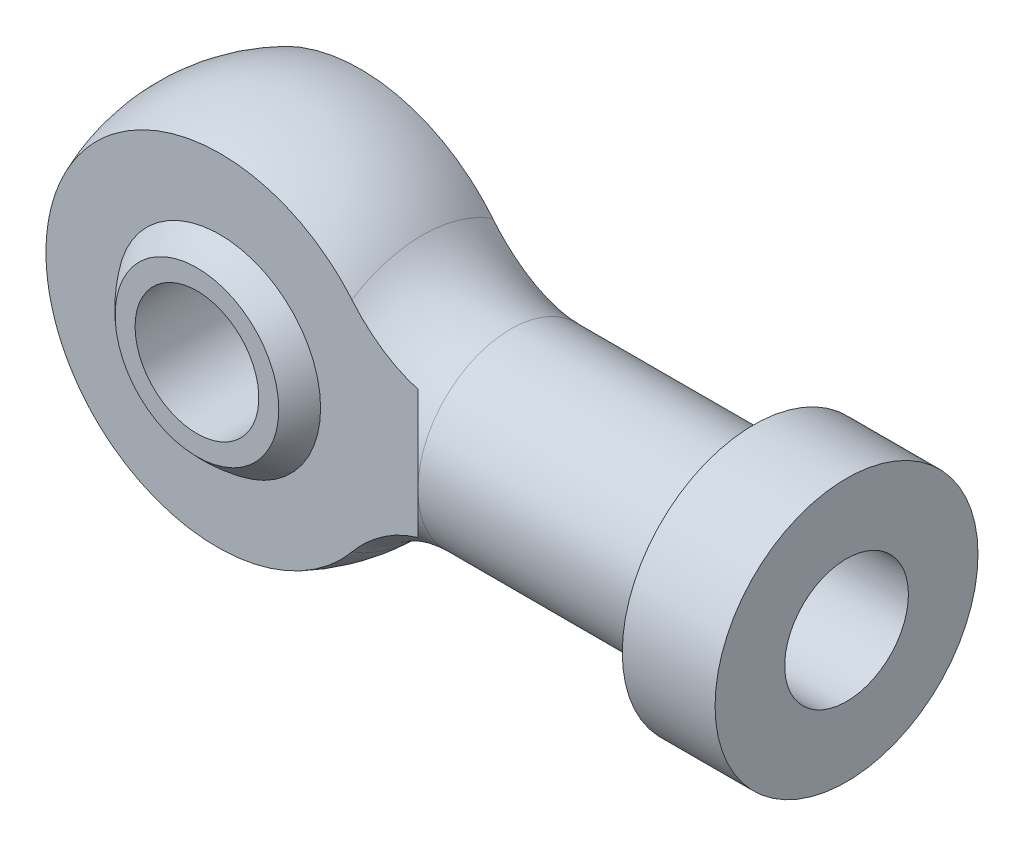
ISO-10303-21;
HEADER;
FILE_DESCRIPTION(('STEP AP214'),'2;1');
FILE_NAME('part.step','',(''),(''),'','','');
FILE_SCHEMA(('AUTOMOTIVE_DESIGN { 1 0 10303 214 1 1 1 1 }'));
ENDSEC;
DATA;
#1=APPLICATION_CONTEXT('core data for automotive mechanical design processes');
#2=APPLICATION_PROTOCOL_DEFINITION('international standard','automotive_design',2000,#1);
#3=PRODUCT_CONTEXT('',#1,'mechanical');
#4=PRODUCT('Part','Part','',(#3));
#5=PRODUCT_RELATED_PRODUCT_CATEGORY('part','',(#4));
#6=PRODUCT_DEFINITION_FORMATION('','',#4);
#7=PRODUCT_DEFINITION_CONTEXT('part definition',#1,'design');
#8=PRODUCT_DEFINITION('design','',#6,#7);
#9=PRODUCT_DEFINITION_SHAPE('','',#8);
#10=(LENGTH_UNIT() NAMED_UNIT(*) SI_UNIT(.MILLI.,.METRE.));
#11=(NAMED_UNIT(*) PLANE_ANGLE_UNIT() SI_UNIT($,.RADIAN.));
#12=(NAMED_UNIT(*) SI_UNIT($,.STERADIAN.) SOLID_ANGLE_UNIT());
#13=UNCERTAINTY_MEASURE_WITH_UNIT(LENGTH_MEASURE(1.E-05),#10,'distance_accuracy_value','');
#14=(GEOMETRIC_REPRESENTATION_CONTEXT(3) GLOBAL_UNCERTAINTY_ASSIGNED_CONTEXT((#13)) GLOBAL_UNIT_ASSIGNED_CONTEXT((#10,
#11,#12)) REPRESENTATION_CONTEXT('',''));
#15=CARTESIAN_POINT('',(0.,0.,0.));
#16=DIRECTION('',(0.,0.,1.));
#17=DIRECTION('',(1.,0.,0.));
#18=AXIS2_PLACEMENT_3D('',#15,#16,#17);
#19=CARTESIAN_POINT('',(0.0422581542258365,-12.5,-4.6299750898934));
#20=DIRECTION('',(-0.00912670011982922,0.,0.999958350805134));
#21=DIRECTION('',(0.999958350805134,0.,0.00912670011982922));
#22=AXIS2_PLACEMENT_3D('',#19,#20,#21);
#23=PLANE('',#22);
#24=DIRECTION('',(0.,1.,0.));
#25=VECTOR('',#24,1.);
#26=CARTESIAN_POINT('',(12.7964236498752,-12.5,-4.5135667978243));
#27=LINE('',#26,#25);
#28=CARTESIAN_POINT('',(12.7964236498752,-4.16158480786618,-4.5135667978243));
#29=VERTEX_POINT('',#28);
#30=CARTESIAN_POINT('',(12.7964236498752,4.16158480786618,-4.5135667978243));
#31=VERTEX_POINT('',#30);
#32=EDGE_CURVE('E88',#29,#31,#27,.T.);
#33=ORIENTED_EDGE('',*,*,#32,.F.);
#34=CARTESIAN_POINT('',(8.35817863747099,-7.32385766302893,-4.55407501624552));
#35=CARTESIAN_POINT('',(8.4458998709203,-7.21051474528737,-4.55327437750773));
#36=CARTESIAN_POINT('',(8.53596775633073,-7.09901109940731,-4.55245232068916));
#37=CARTESIAN_POINT('',(8.72068329239499,-6.87985776005783,-4.55076640716708));
#38=CARTESIAN_POINT('',(8.81533110683538,-6.77220820465756,-4.54990254896869));
#39=CARTESIAN_POINT('',(9.10616690602969,-6.45509503593651,-4.54724806728831));
#40=CARTESIAN_POINT('',(9.3090634382171,-6.25170455611451,-4.5453962143555));
#41=CARTESIAN_POINT('',(9.72473971556463,-5.86956169864926,-4.54160230361189));
#42=CARTESIAN_POINT('',(9.93698062751675,-5.69022177746997,-4.53966516377503));
#43=CARTESIAN_POINT('',(10.3764742452845,-5.35103149247474,-4.53565387025394));
#44=CARTESIAN_POINT('',(10.6037201862185,-5.19117243714522,-4.53357977831333));
#45=CARTESIAN_POINT('',(11.0033211880932,-4.93815458958444,-4.52993258789909));
#46=CARTESIAN_POINT('',(11.1720482919383,-4.83924656540789,-4.52839260208104));
#47=CARTESIAN_POINT('',(11.5164026530707,-4.65431519181695,-4.5252496521907));
#48=CARTESIAN_POINT('',(11.6920279255465,-4.56828816993772,-4.52364670623394));
#49=CARTESIAN_POINT('',(12.0539571867923,-4.40919212186401,-4.52034334881978));
#50=CARTESIAN_POINT('',(12.2404138120469,-4.33646619486379,-4.51864154423693));
#51=CARTESIAN_POINT('',(12.619710154475,-4.20869585511339,-4.51517967607902));
#52=CARTESIAN_POINT('',(12.8125628948826,-4.15369031497932,-4.51341949363985));
#53=CARTESIAN_POINT('',(13.0079591266563,-4.10882649485166,-4.51163609655086));
#54=B_SPLINE_CURVE_WITH_KNOTS('',3,(#34,#35,#36,#37,#38,#39,#40,#41,#42,#43,#44,#45,#46,#47,#48,
#49,#50,#51,#52,#53),.UNSPECIFIED.,.F.,.F.,(4,2,2,2,2,2,2,2,2,4),(0.,0.429909425919432,
0.859834237557637,1.72058233589881,2.55323244040861,3.38550968196544,3.97179618868992,
4.55791522139451,5.15749963966172,5.75839052875296),.UNSPECIFIED.);
#55=CARTESIAN_POINT('',(8.56971411425212,-7.05960212304251,-4.55214431497208));
#56=VERTEX_POINT('',#55);
#57=EDGE_CURVE('E157',#56,#29,#54,.T.);
#58=ORIENTED_EDGE('',*,*,#57,.F.);
#59=CARTESIAN_POINT('',(0.0422581542258365,0.,-4.6299750898934));
#60=DIRECTION('',(-0.00912670011982922,0.,0.999958350805134));
#61=DIRECTION('',(0.999958350805134,0.,0.00912670011982922));
#62=AXIS2_PLACEMENT_3D('',#59,#60,#61);
#63=CIRCLE('',#62,11.0707517773356);
#64=CARTESIAN_POINT('',(8.56971411425212,7.05960212304251,-4.55214431497208));
#65=VERTEX_POINT('',#64);
#66=EDGE_CURVE('E135',#56,#65,#63,.F.);
#67=ORIENTED_EDGE('',*,*,#66,.T.);
#68=CARTESIAN_POINT('',(13.0079591266563,4.10882649485165,-4.51163609655086));
#69=CARTESIAN_POINT('',(12.7850899546431,4.16000422166721,-4.51367024137027));
#70=CARTESIAN_POINT('',(12.5655970674054,4.22434465888993,-4.51567357056757));
#71=CARTESIAN_POINT('',(12.1351753667175,4.37565583382234,-4.51960206397341));
#72=CARTESIAN_POINT('',(11.9242247556973,4.46256414430115,-4.52152742713011));
#73=CARTESIAN_POINT('',(11.5166338372794,4.65321698479729,-4.52524754215387));
#74=CARTESIAN_POINT('',(11.3197674594411,4.7564854057114,-4.52704435738398));
#75=CARTESIAN_POINT('',(10.9349946712431,4.97880070783884,-4.53055620950195));
#76=CARTESIAN_POINT('',(10.7470955352246,5.09786011268654,-4.53227117999631));
#77=CARTESIAN_POINT('',(10.3569521299462,5.36600787309648,-4.53583205016739));
#78=CARTESIAN_POINT('',(10.156010615362,5.51698809374636,-4.53766605949763));
#79=CARTESIAN_POINT('',(9.76662628099556,5.8342131802327,-4.54122000156758));
#80=CARTESIAN_POINT('',(9.57818296637791,6.00045744110487,-4.54293993882369));
#81=CARTESIAN_POINT('',(9.2089075424023,6.35172452367933,-4.54631034525465));
#82=CARTESIAN_POINT('',(9.02846613343789,6.53715767806347,-4.54795724847566));
#83=CARTESIAN_POINT('',(8.68220007105295,6.92105757019634,-4.55111764661676));
#84=CARTESIAN_POINT('',(8.51636885741589,7.11951838773272,-4.55263120141247));
#85=CARTESIAN_POINT('',(8.35817863747099,7.32385766302893,-4.55407501624552));
#86=B_SPLINE_CURVE_WITH_KNOTS('',3,(#68,#69,#70,#71,#72,#73,#74,#75,#76,#77,#78,#79,#80,#81,#82,
#83,#84,#85),.UNSPECIFIED.,.F.,.F.,(4,2,2,2,2,2,2,2,4),(0.,0.685137380260775,1.36839935726479,
2.03455121235177,2.70123457917343,3.45443448550478,4.20760455291298,4.98308058135684,
5.75820661463659),.UNSPECIFIED.);
#87=EDGE_CURVE('E151',#31,#65,#86,.T.);
#88=ORIENTED_EDGE('',*,*,#87,.F.);
#89=EDGE_LOOP('',(#33,#58,#67,#88));
#90=FACE_BOUND('',#89,.T.);
#91=CARTESIAN_POINT('',(0.0422581542258365,0.,-4.6299750898934));
#92=DIRECTION('',(-0.00912670011982922,0.,0.999958350805134));
#93=DIRECTION('',(0.999958350805134,0.,0.00912670011982922));
#94=AXIS2_PLACEMENT_3D('',#91,#92,#93);
#95=CIRCLE('',#94,6.52392097709419);
#96=CARTESIAN_POINT('',(6.56590741526396,0.,-4.57043321953));
#97=VERTEX_POINT('',#96);
#98=EDGE_CURVE('E11',#97,#97,#95,.F.);
#99=ORIENTED_EDGE('',*,*,#98,.F.);
#100=EDGE_LOOP('',(#99));
#101=FACE_BOUND('',#100,.T.);
#102=ADVANCED_FACE('F34',(#90,#101),#23,.F.);
#103=CARTESIAN_POINT('',(0.0422581542167409,-12.5,4.62997508728362));
#104=DIRECTION('',(-0.00912670012300901,0.,-0.999958350805105));
#105=DIRECTION('',(-0.999958350805105,0.,0.00912670012300901));
#106=AXIS2_PLACEMENT_3D('',#103,#104,#105);
#107=PLANE('',#106);
#108=DIRECTION('',(0.,1.,0.));
#109=VECTOR('',#108,1.);
#110=CARTESIAN_POINT('',(12.7964236522398,-12.5,4.51356679515228));
#111=LINE('',#110,#109);
#112=CARTESIAN_POINT('',(12.7964236522398,-4.16158481010453,4.51356679515228));
#113=VERTEX_POINT('',#112);
#114=CARTESIAN_POINT('',(12.7964236522398,4.16158481010453,4.51356679515228));
#115=VERTEX_POINT('',#114);
#116=EDGE_CURVE('E85',#113,#115,#111,.T.);
#117=ORIENTED_EDGE('',*,*,#116,.T.);
#118=CARTESIAN_POINT('',(8.35817863735276,7.323857664821,4.55407501361028));
#119=CARTESIAN_POINT('',(8.44589987077188,7.2105147471393,4.55327437487249));
#120=CARTESIAN_POINT('',(8.53596775615084,7.09901110131843,4.55245231805392));
#121=CARTESIAN_POINT('',(8.72068329214966,6.87985776208594,4.55076640453185));
#122=CARTESIAN_POINT('',(8.81533110655608,6.77220820674347,4.54990254633347));
#123=CARTESIAN_POINT('',(9.10616690564388,6.45509503819483,4.54724806465314));
#124=CARTESIAN_POINT('',(9.30906343775508,6.25170455848521,4.54539621172037));
#125=CARTESIAN_POINT('',(9.72473971493965,5.86956170123708,4.54160230097693));
#126=CARTESIAN_POINT('',(9.93698062680507,5.69022178016248,4.53966516114019));
#127=CARTESIAN_POINT('',(10.3764742443892,5.3510314953657,4.53565386761938));
#128=CARTESIAN_POINT('',(10.6037201852262,5.19117244012999,4.53357977567893));
#129=CARTESIAN_POINT('',(11.0033211872515,4.93815459250735,4.52993258526204));
#130=CARTESIAN_POINT('',(11.1720482913612,4.83924656820198,4.52839259944104));
#131=CARTESIAN_POINT('',(11.516402653042,4.6543151943946,4.5252496495446));
#132=CARTESIAN_POINT('',(11.6920279258017,4.56828817242774,4.52364670358469));
#133=CARTESIAN_POINT('',(12.0539571876481,4.40919212422018,4.5203433461639));
#134=CARTESIAN_POINT('',(12.2404138132204,4.33646619717573,4.51864154157756));
#135=CARTESIAN_POINT('',(12.619710156296,4.20869585739443,4.51517967341253));
#136=CARTESIAN_POINT('',(12.8125628970336,4.15369031727391,4.51341949096974));
#137=CARTESIAN_POINT('',(13.0079591291392,4.1088264971923,4.51163609387709));
#138=B_SPLINE_CURVE_WITH_KNOTS('',3,(#118,#119,#120,#121,#122,#123,#124,#125,#126,#127,#128,
#129,#130,#131,#132,#133,#134,#135,#136,#137),.UNSPECIFIED.,.F.,.F.,(4,2,2,2,2,2,2,2,2,4),(0.,
0.429909425722025,0.859834237162776,1.72058233510436,2.55323243921326,3.38550968037197,
3.97179618797444,4.55791522155665,5.15749964075588,5.75839053078429),.UNSPECIFIED.);
#139=CARTESIAN_POINT('',(8.56971411425212,7.05960212474289,4.55214431233509));
#140=VERTEX_POINT('',#139);
#141=EDGE_CURVE('E49',#140,#115,#138,.T.);
#142=ORIENTED_EDGE('',*,*,#141,.F.);
#143=CARTESIAN_POINT('',(0.0422581542167409,0.,4.62997508728362));
#144=DIRECTION('',(-0.00912670012300901,0.,-0.999958350805105));
#145=DIRECTION('',(-0.999958350805105,0.,0.00912670012300901));
#146=AXIS2_PLACEMENT_3D('',#143,#144,#145);
#147=CIRCLE('',#146,11.0707517784271);
#148=CARTESIAN_POINT('',(8.56971411425212,-7.05960212474289,4.55214431233509));
#149=VERTEX_POINT('',#148);
#150=EDGE_CURVE('E86',#140,#149,#147,.F.);
#151=ORIENTED_EDGE('',*,*,#150,.T.);
#152=CARTESIAN_POINT('',(13.0079591291392,-4.10882649719228,4.51163609387709));
#153=CARTESIAN_POINT('',(12.7850899570412,-4.16000422388761,4.51367023869799));
#154=CARTESIAN_POINT('',(12.5655970697118,-4.22434466099821,4.51567356789683));
#155=CARTESIAN_POINT('',(12.1351753688335,-4.37565583572589,4.51960206130577));
#156=CARTESIAN_POINT('',(11.9242247577144,-4.46256414611202,4.52152742446404));
#157=CARTESIAN_POINT('',(11.5166338391074,-4.65321698644349,4.52524753949082));
#158=CARTESIAN_POINT('',(11.3197674611785,-4.75648540728435,4.52704435472239));
#159=CARTESIAN_POINT('',(10.9349946728007,-4.97880070928409,4.53055620684322));
#160=CARTESIAN_POINT('',(10.747095536693,-5.09786011407734,4.53227117733899));
#161=CARTESIAN_POINT('',(10.3569521311807,-5.36600787442281,4.53583204751345));
#162=CARTESIAN_POINT('',(10.156010616455,-5.51698809506912,4.53766605684562));
#163=CARTESIAN_POINT('',(9.76662628181868,-5.83421318157424,4.54121999891927));
#164=CARTESIAN_POINT('',(9.57818296707259,-6.00045744246879,4.54293993617715));
#165=CARTESIAN_POINT('',(9.20890754284201,-6.35172452512017,4.54631034261161));
#166=CARTESIAN_POINT('',(9.02846613375221,-6.53715767956026,4.54795724583434));
#167=CARTESIAN_POINT('',(8.68220007113607,-6.92105757182591,4.55111764397865));
#168=CARTESIAN_POINT('',(8.51636885739315,-7.11951838943908,4.55263119877586));
#169=CARTESIAN_POINT('',(8.35817863735276,-7.323857664821,4.55407501361028));
#170=B_SPLINE_CURVE_WITH_KNOTS('',3,(#152,#153,#154,#155,#156,#157,#158,#159,#160,#161,#162,
#163,#164,#165,#166,#167,#168,#169),.UNSPECIFIED.,.F.,.F.,(4,2,2,2,2,2,2,2,4),(0.,
0.685137380428407,1.36839935759922,2.03455121282361,2.70123457978274,3.45443448644478,
4.20760455418462,4.9830805830093,5.75820661666758),.UNSPECIFIED.);
#171=EDGE_CURVE('E81',#113,#149,#170,.T.);
#172=ORIENTED_EDGE('',*,*,#171,.F.);
#173=EDGE_LOOP('',(#117,#142,#151,#172));
#174=FACE_BOUND('',#173,.T.);
#175=CARTESIAN_POINT('',(0.0422581542167409,0.,4.62997508728362));
#176=DIRECTION('',(-0.00912670012300901,0.,-0.999958350805105));
#177=DIRECTION('',(-0.999958350805105,0.,0.00912670012300901));
#178=AXIS2_PLACEMENT_3D('',#175,#176,#177);
#179=CIRCLE('',#178,6.52392097894529);
#180=CARTESIAN_POINT('',(6.5659074171057,0.,4.57043321688257));
#181=VERTEX_POINT('',#180);
#182=EDGE_CURVE('E42',#181,#181,#179,.F.);
#183=ORIENTED_EDGE('',*,*,#182,.F.);
#184=EDGE_LOOP('',(#183));
#185=FACE_BOUND('',#184,.T.);
#186=ADVANCED_FACE('F83',(#174,#185),#107,.F.);
#187=CARTESIAN_POINT('',(14.2828568570863,0.,0.));
#188=DIRECTION('',(1.,0.,0.));
#189=DIRECTION('',(0.,0.,-1.));
#190=AXIS2_PLACEMENT_3D('',#187,#188,#189);
#191=TOROIDAL_SURFACE('',#190,13.9999999999993,7.99999999999916);
#192=CARTESIAN_POINT('',(12.7962236522398,-4.16185750858254,4.51336679515228));
#193=CARTESIAN_POINT('',(12.8514169965149,-4.08660014340141,4.56856013942736));
#194=CARTESIAN_POINT('',(12.90583061802,-4.01020286948326,4.62297376093248));
#195=CARTESIAN_POINT('',(13.0129126763343,-3.85495699805703,4.73005581924674));
#196=CARTESIAN_POINT('',(13.0655805767727,-3.77610766131706,4.78272371968512));
#197=CARTESIAN_POINT('',(13.2210617795657,-3.5350354290278,4.93820492247818));
#198=CARTESIAN_POINT('',(13.3208955623201,-3.36890431814518,5.03803870523256));
#199=CARTESIAN_POINT('',(13.512021993998,-3.02265019727117,5.22916513691041));
#200=CARTESIAN_POINT('',(13.60314959907,-2.84234376954337,5.32029274198244));
#201=CARTESIAN_POINT('',(13.7721003430202,-2.46993181060336,5.48924348593268));
#202=CARTESIAN_POINT('',(13.8499480741991,-2.27784900464742,5.56709121711156));
#203=CARTESIAN_POINT('',(13.9603980881588,-1.96403999310351,5.67754123107123));
#204=CARTESIAN_POINT('',(13.9983941917401,-1.84608531096998,5.71553733465257));
#205=CARTESIAN_POINT('',(14.068058631828,-1.60645755579415,5.78520177474046));
#206=CARTESIAN_POINT('',(14.0997266913795,-1.48478432027312,5.81686983429197));
#207=CARTESIAN_POINT('',(14.1558909548839,-1.23886800092909,5.87303409779637));
#208=CARTESIAN_POINT('',(14.1804243198099,-1.11464197751866,5.89756746272239));
#209=CARTESIAN_POINT('',(14.2219358812316,-0.863694302184585,5.93907902414404));
#210=CARTESIAN_POINT('',(14.2389152877527,-0.7369730533553,5.95605843066514));
#211=CARTESIAN_POINT('',(14.2649702009972,-0.480780170423606,5.9821133439097));
#212=CARTESIAN_POINT('',(14.2739758201308,-0.351294210294176,5.99111896304325));
#213=CARTESIAN_POINT('',(14.2835605605988,-0.0916948201962116,6.00070370351122));
#214=CARTESIAN_POINT('',(14.2841396315596,0.0384186135186875,6.00128277447203));
#215=CARTESIAN_POINT('',(14.2768513693486,0.298240782452918,5.99399451226101));
#216=CARTESIAN_POINT('',(14.2689793054755,0.427949250202767,5.98612244838797));
#217=CARTESIAN_POINT('',(14.2450191268769,0.685827277877592,5.96216226978936));
#218=CARTESIAN_POINT('',(14.2289311436077,0.813996862391435,5.94607428652019));
#219=CARTESIAN_POINT('',(14.1904692287076,1.05850330852864,5.90761237162004));
#220=CARTESIAN_POINT('',(14.1686469804003,1.17501522777168,5.88579012331279));
#221=CARTESIAN_POINT('',(14.1188251686498,1.40538265365133,5.83596831156225));
#222=CARTESIAN_POINT('',(14.0908233865589,1.51923718992801,5.8079665294714));
#223=CARTESIAN_POINT('',(13.9981618787024,1.85680602458247,5.71530502161484));
#224=CARTESIAN_POINT('',(13.9249481263614,2.07590492195369,5.6420912692739));
#225=CARTESIAN_POINT('',(13.7742822797664,2.46393417037587,5.49142542267886));
#226=CARTESIAN_POINT('',(13.6996202603363,2.63509949245376,5.41676340324876));
#227=CARTESIAN_POINT('',(13.5399715133743,2.96780870150042,5.25711465628679));
#228=CARTESIAN_POINT('',(13.454971242489,3.12933954534199,5.17211438540145));
#229=CARTESIAN_POINT('',(13.2777982150899,3.44106084385847,4.99494135800237));
#230=CARTESIAN_POINT('',(13.1857229882985,3.59136348906066,4.90286613121097));
#231=CARTESIAN_POINT('',(12.9953289132608,3.88300058785956,4.71247205617326));
#232=CARTESIAN_POINT('',(12.897030463173,4.02436158473678,4.61417360608546));
#233=CARTESIAN_POINT('',(12.7962236522398,4.16185750858254,4.51336679515228));
#234=B_SPLINE_CURVE_WITH_KNOTS('',3,(#192,#193,#194,#195,#196,#197,#198,#199,#200,#201,#202,
#203,#204,#205,#206,#207,#208,#209,#210,#211,#212,#213,#214,#215,#216,#217,#218,#219,#220,#221,
#222,#223,#224,#225,#226,#227,#228,#229,#230,#231,#232,#233),.UNSPECIFIED.,.F.,.F.,(4,2,2,2,2,2,
2,2,2,2,2,2,2,2,2,2,2,2,2,2,4),(0.,0.325256833046405,0.650612691575737,1.30399765737277,
1.96799392303089,2.63074689643091,3.01929262457094,3.40785535419381,3.79435644509836,
4.18079560228855,4.57058916780491,4.96038506349263,5.35039926949173,5.74040723537847,
6.10162549398483,6.46297365294542,7.18756334498111,7.79012958884609,8.39349388750311,
8.98966894943956,9.58398204237179),.UNSPECIFIED.);
#235=CARTESIAN_POINT('',(14.2828568570856,-1.72587638624933E-11,5.99999999999805));
#236=VERTEX_POINT('',#235);
#237=EDGE_CURVE('E92',#113,#236,#234,.T.);
#238=ORIENTED_EDGE('',*,*,#237,.F.);
#239=ORIENTED_EDGE('',*,*,#171,.T.);
#240=CARTESIAN_POINT('',(8.56971411425212,0.,0.));
#241=DIRECTION('',(1.,0.,0.));
#242=DIRECTION('',(0.,0.,-1.));
#243=AXIS2_PLACEMENT_3D('',#240,#241,#242);
#244=CIRCLE('',#243,8.39999999999994);
#245=EDGE_CURVE('E57',#149,#56,#244,.T.);
#246=ORIENTED_EDGE('',*,*,#245,.T.);
#247=ORIENTED_EDGE('',*,*,#57,.T.);
#248=CARTESIAN_POINT('',(12.7962236498751,-4.16185750634383,-4.51336679782497));
#249=CARTESIAN_POINT('',(12.8514169942187,-4.08660014116954,-4.56856014198167));
#250=CARTESIAN_POINT('',(12.9058306157933,-4.01020286726202,-4.62297376337205));
#251=CARTESIAN_POINT('',(13.0129126742483,-3.85495699586399,-4.73005582146446));
#252=CARTESIAN_POINT('',(13.0655805747579,-3.77610765914158,-4.78272372179574));
#253=CARTESIAN_POINT('',(13.2210617777684,-3.53503542691288,-4.93820492427977));
#254=CARTESIAN_POINT('',(13.3208955606709,-3.36890431608267,-5.03803870684431));
#255=CARTESIAN_POINT('',(13.5120219926568,-3.02265019531659,-5.22916513818311));
#256=CARTESIAN_POINT('',(13.6031495978878,-2.84234376764358,-5.32029274310558));
#257=CARTESIAN_POINT('',(13.7721003421454,-2.46993180881902,-5.48924348679107));
#258=CARTESIAN_POINT('',(13.8499480734726,-2.27784900292377,-5.56709121785474));
#259=CARTESIAN_POINT('',(13.960398087597,-1.96403999161599,-5.67754123160519));
#260=CARTESIAN_POINT('',(13.99839419121,-1.84608530966435,-5.71553733508956));
#261=CARTESIAN_POINT('',(14.0680586313653,-1.60645755485776,-5.7852017750089));
#262=CARTESIAN_POINT('',(14.0997266909524,-1.4847843195241,-5.81686983448884));
#263=CARTESIAN_POINT('',(14.1558909545298,-1.23886800055804,-5.87303409787602));
#264=CARTESIAN_POINT('',(14.1804243194931,-1.11464197733825,-5.89756746275634));
#265=CARTESIAN_POINT('',(14.2219358809898,-0.863694302385679,-5.93907902411241));
#266=CARTESIAN_POINT('',(14.2389152875485,-0.736973053747269,-5.95605843061363));
#267=CARTESIAN_POINT('',(14.2649702008672,-0.480780171192146,-5.98211334384413));
#268=CARTESIAN_POINT('',(14.273975820037,-0.351294211248332,-5.99111896298342));
#269=CARTESIAN_POINT('',(14.283560560573,-0.0916948215180576,-6.00070370348704));
#270=CARTESIAN_POINT('',(14.2841396315657,0.0384186120147682,-6.00128277447776));
#271=CARTESIAN_POINT('',(14.2768513694131,0.298240780588961,-5.99399451234979));
#272=CARTESIAN_POINT('',(14.2689793055666,0.427949248160849,-5.98612244852992));
#273=CARTESIAN_POINT('',(14.2450191270156,0.68582727548488,-5.96216227006004));
#274=CARTESIAN_POINT('',(14.2289311437675,0.813996859825892,-5.94607428686645));
#275=CARTESIAN_POINT('',(14.1904692289087,1.0585033056034,-5.90761237213783));
#276=CARTESIAN_POINT('',(14.1686469806238,1.17501522465974,-5.88579012392684));
#277=CARTESIAN_POINT('',(14.1188251689184,1.40538265017339,-5.83596831239012));
#278=CARTESIAN_POINT('',(14.0908233868503,1.51923718627076,-5.80796653041684));
#279=CARTESIAN_POINT('',(13.9981618790631,1.85680602040234,-5.71530502294336));
#280=CARTESIAN_POINT('',(13.9249481267703,2.07590491744246,-5.64209127089845));
#281=CARTESIAN_POINT('',(13.7742822800709,2.46393416581679,-5.49142542470917));
#282=CARTESIAN_POINT('',(13.6996202604501,2.63509948814157,-5.41676340534123));
#283=CARTESIAN_POINT('',(13.5399715130606,2.96780869766048,-5.25711465849229));
#284=CARTESIAN_POINT('',(13.4549712419383,3.12933954172731,-5.17211438765769));
#285=CARTESIAN_POINT('',(13.2777982140459,3.4410608406644,-4.99494136036521));
#286=CARTESIAN_POINT('',(13.1857229869993,3.59136348606283,-4.90286613363031));
#287=CARTESIAN_POINT('',(12.9953289114372,3.88300058524491,-4.71247205871289));
#288=CARTESIAN_POINT('',(12.8970304610805,4.02436158230928,-4.61417360868901));
#289=CARTESIAN_POINT('',(12.7962236498752,4.16185750634382,-4.51336679782498));
#290=B_SPLINE_CURVE_WITH_KNOTS('',3,(#248,#249,#250,#251,#252,#253,#254,#255,#256,#257,#258,
#259,#260,#261,#262,#263,#264,#265,#266,#267,#268,#269,#270,#271,#272,#273,#274,#275,#276,#277,
#278,#279,#280,#281,#282,#283,#284,#285,#286,#287,#288,#289),.UNSPECIFIED.,.F.,.F.,(4,2,2,2,2,2,
2,2,2,2,2,2,2,2,2,2,2,2,2,2,4),(0.,0.325256832956081,0.650612691395072,1.30399765701772,
1.96799392255582,2.63074689583338,3.01929262342045,3.40785535249057,3.79435644284048,
4.18079559947584,4.57058916444731,4.96038505959008,5.35039926504319,5.74040723038396,
6.10162548838523,6.46297364674044,7.1875633375733,7.79012958220707,8.39349388164025,
8.98966894429745,9.58398203793424),.UNSPECIFIED.);
#291=CARTESIAN_POINT('',(14.2828568570856,0.,-6.00000000000197));
#292=VERTEX_POINT('',#291);
#293=EDGE_CURVE('E129',#29,#292,#290,.T.);
#294=ORIENTED_EDGE('',*,*,#293,.T.);
#295=CARTESIAN_POINT('',(14.2828568570863,0.,0.));
#296=DIRECTION('',(1.,0.,0.));
#297=DIRECTION('',(0.,0.,-1.));
#298=AXIS2_PLACEMENT_3D('',#295,#296,#297);
#299=CIRCLE('',#298,6.00000000000023);
#300=EDGE_CURVE('E100',#236,#292,#299,.T.);
#301=ORIENTED_EDGE('',*,*,#300,.F.);
#302=EDGE_LOOP('',(#238,#239,#246,#247,#294,#301));
#303=FACE_BOUND('',#302,.T.);
#304=ADVANCED_FACE('F98',(#303),#191,.F.);
#305=CARTESIAN_POINT('',(35.9999999999996,0.,0.));
#306=DIRECTION('',(-1.,0.,0.));
#307=DIRECTION('',(0.,0.,1.));
#308=AXIS2_PLACEMENT_3D('',#305,#306,#307);
#309=PLANE('',#308);
#310=CARTESIAN_POINT('',(35.9999999999996,0.,0.));
#311=DIRECTION('',(1.,0.,0.));
#312=DIRECTION('',(0.,0.,-1.));
#313=AXIS2_PLACEMENT_3D('',#310,#311,#312);
#314=CIRCLE('',#313,4.);
#315=CARTESIAN_POINT('',(35.9999999999996,0.,-4.));
#316=VERTEX_POINT('',#315);
#317=EDGE_CURVE('E183',#316,#316,#314,.T.);
#318=ORIENTED_EDGE('',*,*,#317,.F.);
#319=EDGE_LOOP('',(#318));
#320=FACE_BOUND('',#319,.T.);
#321=CARTESIAN_POINT('',(35.9999999999996,0.,0.));
#322=DIRECTION('',(1.,0.,0.));
#323=DIRECTION('',(0.,0.,-1.));
#324=AXIS2_PLACEMENT_3D('',#321,#322,#323);
#325=CIRCLE('',#324,8.49999999999973);
#326=CARTESIAN_POINT('',(35.9999999999996,0.,-8.49999999999973));
#327=VERTEX_POINT('',#326);
#328=EDGE_CURVE('E137',#327,#327,#325,.T.);
#329=ORIENTED_EDGE('',*,*,#328,.T.);
#330=EDGE_LOOP('',(#329));
#331=FACE_BOUND('',#330,.T.);
#332=ADVANCED_FACE('F36',(#320,#331),#309,.F.);
#333=CARTESIAN_POINT('',(35.9999999999996,0.,0.));
#334=DIRECTION('',(1.,0.,0.));
#335=DIRECTION('',(0.,0.,-1.));
#336=AXIS2_PLACEMENT_3D('',#333,#334,#335);
#337=CYLINDRICAL_SURFACE('',#336,8.49999999999973);
#338=ORIENTED_EDGE('',*,*,#328,.F.);
#339=EDGE_LOOP('',(#338));
#340=FACE_BOUND('',#339,.T.);
#341=CARTESIAN_POINT('',(29.9999999999994,0.,0.));
#342=DIRECTION('',(1.,0.,0.));
#343=DIRECTION('',(0.,0.,-1.));
#344=AXIS2_PLACEMENT_3D('',#341,#342,#343);
#345=CIRCLE('',#344,8.49999999999973);
#346=CARTESIAN_POINT('',(29.9999999999994,0.,-8.49999999999973));
#347=VERTEX_POINT('',#346);
#348=EDGE_CURVE('E140',#347,#347,#345,.T.);
#349=ORIENTED_EDGE('',*,*,#348,.T.);
#350=EDGE_LOOP('',(#349));
#351=FACE_BOUND('',#350,.T.);
#352=ADVANCED_FACE('F200',(#340,#351),#337,.T.);
#353=CARTESIAN_POINT('',(29.9999999999994,0.,0.));
#354=DIRECTION('',(1.,0.,0.));
#355=DIRECTION('',(0.,0.,-1.));
#356=AXIS2_PLACEMENT_3D('',#353,#354,#355);
#357=PLANE('',#356);
#358=ORIENTED_EDGE('',*,*,#348,.F.);
#359=EDGE_LOOP('',(#358));
#360=FACE_BOUND('',#359,.T.);
#361=CARTESIAN_POINT('',(29.9999999999994,0.,0.));
#362=DIRECTION('',(1.,0.,0.));
#363=DIRECTION('',(0.,0.,-1.));
#364=AXIS2_PLACEMENT_3D('',#361,#362,#363);
#365=CIRCLE('',#364,6.00000000000023);
#366=CARTESIAN_POINT('',(29.9999999999994,0.,-6.00000000000023));
#367=VERTEX_POINT('',#366);
#368=EDGE_CURVE('E143',#367,#367,#365,.T.);
#369=ORIENTED_EDGE('',*,*,#368,.T.);
#370=EDGE_LOOP('',(#369));
#371=FACE_BOUND('',#370,.T.);
#372=ADVANCED_FACE('F205',(#360,#371),#357,.F.);
#373=CARTESIAN_POINT('',(35.9999999999996,0.,0.));
#374=DIRECTION('',(1.,0.,0.));
#375=DIRECTION('',(0.,0.,-1.));
#376=AXIS2_PLACEMENT_3D('',#373,#374,#375);
#377=CYLINDRICAL_SURFACE('',#376,6.00000000000023);
#378=ORIENTED_EDGE('',*,*,#368,.F.);
#379=EDGE_LOOP('',(#378));
#380=FACE_BOUND('',#379,.T.);
#381=EDGE_CURVE('E146',#292,#236,#299,.T.);
#382=ORIENTED_EDGE('',*,*,#381,.T.);
#383=ORIENTED_EDGE('',*,*,#300,.T.);
#384=EDGE_LOOP('',(#382,#383));
#385=FACE_BOUND('',#384,.T.);
#386=ADVANCED_FACE('F210',(#380,#385),#377,.T.);
#387=EDGE_CURVE('E148',#65,#140,#244,.T.);
#388=ORIENTED_EDGE('',*,*,#387,.T.);
#389=ORIENTED_EDGE('',*,*,#141,.T.);
#390=EDGE_CURVE('E94',#236,#115,#234,.T.);
#391=ORIENTED_EDGE('',*,*,#390,.F.);
#392=ORIENTED_EDGE('',*,*,#381,.F.);
#393=EDGE_CURVE('E134',#292,#31,#290,.T.);
#394=ORIENTED_EDGE('',*,*,#393,.T.);
#395=ORIENTED_EDGE('',*,*,#87,.T.);
#396=EDGE_LOOP('',(#388,#389,#391,#392,#394,#395));
#397=FACE_BOUND('',#396,.T.);
#398=ADVANCED_FACE('F111',(#397),#191,.F.);
#399=CARTESIAN_POINT('',(0.,0.,0.));
#400=DIRECTION('',(1.,0.,0.));
#401=DIRECTION('',(0.,1.,0.));
#402=AXIS2_PLACEMENT_3D('',#399,#400,#401);
#403=SPHERICAL_SURFACE('',#402,12.0000000000005);
#404=ORIENTED_EDGE('',*,*,#245,.F.);
#405=ORIENTED_EDGE('',*,*,#150,.F.);
#406=ORIENTED_EDGE('',*,*,#387,.F.);
#407=ORIENTED_EDGE('',*,*,#66,.F.);
#408=EDGE_LOOP('',(#404,#405,#406,#407));
#409=FACE_BOUND('',#408,.T.);
#410=ADVANCED_FACE('F126',(#409),#403,.T.);
#411=CARTESIAN_POINT('',(4.14142840436234,-12.5,4.1414284183844));
#412=DIRECTION('',(0.707106779989486,0.,0.70710678238361));
#413=DIRECTION('',(0.70710678238361,0.,-0.707106779989486));
#414=AXIS2_PLACEMENT_3D('',#411,#412,#413);
#415=PLANE('',#414);
#416=ORIENTED_EDGE('',*,*,#32,.T.);
#417=ORIENTED_EDGE('',*,*,#393,.F.);
#418=ORIENTED_EDGE('',*,*,#293,.F.);
#419=EDGE_LOOP('',(#416,#417,#418));
#420=FACE_BOUND('',#419,.T.);
#421=ADVANCED_FACE('F120',(#420),#415,.F.);
#422=CARTESIAN_POINT('',(4.14142842854377,-12.5,-4.14142842854377));
#423=DIRECTION('',(-0.707106781186548,0.,0.707106781186548));
#424=DIRECTION('',(0.707106781186548,0.,0.707106781186548));
#425=AXIS2_PLACEMENT_3D('',#422,#423,#424);
#426=PLANE('',#425);
#427=ORIENTED_EDGE('',*,*,#237,.T.);
#428=ORIENTED_EDGE('',*,*,#390,.T.);
#429=ORIENTED_EDGE('',*,*,#116,.F.);
#430=EDGE_LOOP('',(#427,#428,#429));
#431=FACE_BOUND('',#430,.T.);
#432=ADVANCED_FACE('F91',(#431),#426,.T.);
#433=CARTESIAN_POINT('',(0.,0.,5.9999999999995));
#434=DIRECTION('',(0.,0.,-1.));
#435=DIRECTION('',(-1.,0.,0.));
#436=AXIS2_PLACEMENT_3D('',#433,#434,#435);
#437=PLANE('',#436);
#438=CARTESIAN_POINT('',(0.,0.,5.9999999999995));
#439=DIRECTION('',(0.,0.,-1.));
#440=DIRECTION('',(-1.,0.,0.));
#441=AXIS2_PLACEMENT_3D('',#438,#439,#440);
#442=CIRCLE('',#441,4.);
#443=CARTESIAN_POINT('',(-3.99999999999996,0.,5.99999999999953));
#444=VERTEX_POINT('',#443);
#445=EDGE_CURVE('E176',#444,#444,#442,.T.);
#446=ORIENTED_EDGE('',*,*,#445,.T.);
#447=EDGE_LOOP('',(#446));
#448=FACE_BOUND('',#447,.T.);
#449=CARTESIAN_POINT('',(1.26634813746307E-13,0.,5.99999999999952));
#450=DIRECTION('',(0.,0.,-1.));
#451=DIRECTION('',(-1.,0.,0.));
#452=AXIS2_PLACEMENT_3D('',#449,#450,#451);
#453=CIRCLE('',#452,5.29150262212835);
#454=CARTESIAN_POINT('',(5.29150262212856,0.,5.99999999999948));
#455=VERTEX_POINT('',#454);
#456=EDGE_CURVE('E95',#455,#455,#453,.T.);
#457=ORIENTED_EDGE('',*,*,#456,.F.);
#458=EDGE_LOOP('',(#457));
#459=FACE_BOUND('',#458,.T.);
#460=ADVANCED_FACE('F119',(#448,#459),#437,.F.);
#461=CARTESIAN_POINT('',(0.,0.,0.));
#462=DIRECTION('',(0.,0.,-1.));
#463=DIRECTION('',(1.,0.,0.));
#464=AXIS2_PLACEMENT_3D('',#461,#462,#463);
#465=SPHERICAL_SURFACE('',#464,7.9999999999992);
#466=CARTESIAN_POINT('',(5.29150262212856,0.,5.99999999999948));
#467=CARTESIAN_POINT('',(5.30650062954041,0.,5.98677300276064));
#468=CARTESIAN_POINT('',(5.32144904031884,0.,5.97348976825528));
#469=CARTESIAN_POINT('',(5.35124583242459,0.,5.94681157664642));
#470=CARTESIAN_POINT('',(5.36609421375191,0.,5.9334166195429));
#471=CARTESIAN_POINT('',(5.39569011077117,0.,5.90651573467257));
#472=CARTESIAN_POINT('',(5.41043762646312,0.,5.89300980690574));
#473=CARTESIAN_POINT('',(5.43983096320677,0.,5.86588774056749));
#474=CARTESIAN_POINT('',(5.45447678425848,0.,5.85227160199606));
#475=CARTESIAN_POINT('',(5.4836659080317,0.,5.8249298796539));
#476=CARTESIAN_POINT('',(5.49820921075322,0.,5.81120429588317));
#477=CARTESIAN_POINT('',(5.52719248004943,0.,5.78364445502321));
#478=CARTESIAN_POINT('',(5.54163244662412,0.,5.76981019793398));
#479=CARTESIAN_POINT('',(5.57040823159211,0.,5.74203378839666));
#480=CARTESIAN_POINT('',(5.58474404998542,0.,5.72809163594857));
#481=CARTESIAN_POINT('',(5.61331073242062,0.,5.70010021972931));
#482=CARTESIAN_POINT('',(5.62754159646252,0.,5.68605095595814));
#483=CARTESIAN_POINT('',(5.65589756992488,0.,5.65784610714957));
#484=CARTESIAN_POINT('',(5.67002267934534,0.,5.64369052211217));
#485=CARTESIAN_POINT('',(5.69816634924244,0.,5.61527382680756));
#486=CARTESIAN_POINT('',(5.71218490971909,0.,5.60101271654034));
#487=CARTESIAN_POINT('',(5.74011469339779,0.,5.57238577274653));
#488=CARTESIAN_POINT('',(5.75402591659984,0.,5.55801993921994));
#489=CARTESIAN_POINT('',(5.78174024343472,0.,5.52918435676697));
#490=CARTESIAN_POINT('',(5.79554334706754,0.,5.51471460784058));
#491=CARTESIAN_POINT('',(5.82304065854937,0.,5.48567200829124));
#492=CARTESIAN_POINT('',(5.83673486639838,0.,5.47109915766828));
#493=CARTESIAN_POINT('',(5.86401361622176,0.,5.44185117422692));
#494=CARTESIAN_POINT('',(5.87759815819612,0.,5.42717604140852));
#495=CARTESIAN_POINT('',(5.9046568123464,0.,5.39772431882921));
#496=CARTESIAN_POINT('',(5.91813092452232,0.,5.38294772906831));
#497=CARTESIAN_POINT('',(5.94496796136188,0.,5.35329392356237));
#498=CARTESIAN_POINT('',(5.95833088602554,0.,5.33841670781733));
#499=CARTESIAN_POINT('',(5.98494479637939,0.,5.30856248696014));
#500=CARTESIAN_POINT('',(5.99819578206958,0.,5.29358548184799));
#501=CARTESIAN_POINT('',(6.02458506931016,0.,5.26353252448525));
#502=CARTESIAN_POINT('',(6.03772337086056,0.,5.24845657223467));
#503=CARTESIAN_POINT('',(6.06388655099198,0.,5.218206568388));
#504=CARTESIAN_POINT('',(6.07691142957301,0.,5.20303251679192));
#505=CARTESIAN_POINT('',(6.10284703131444,0.,5.1725871675638));
#506=CARTESIAN_POINT('',(6.11575775447484,0.,5.15731586993175));
#507=CARTESIAN_POINT('',(6.14146431934328,0.,5.12667688740986));
#508=CARTESIAN_POINT('',(6.15426016105132,0.,5.11130920252));
#509=CARTESIAN_POINT('',(6.17973624344361,0.,5.08047830968094));
#510=CARTESIAN_POINT('',(6.19241648412787,0.,5.06501510173173));
#511=CARTESIAN_POINT('',(6.21766065140198,0.,5.03399403234415));
#512=CARTESIAN_POINT('',(6.23022457799183,0.,5.01843617090577));
#513=CARTESIAN_POINT('',(6.25523541054746,0.,4.98722666943287));
#514=CARTESIAN_POINT('',(6.26768231651323,0.,4.97157502939834));
#515=CARTESIAN_POINT('',(6.29245840787145,0.,4.94017885089966));
#516=CARTESIAN_POINT('',(6.30478759326391,0.,4.92443431243551));
#517=CARTESIAN_POINT('',(6.32932755014695,0.,4.89285322246869));
#518=CARTESIAN_POINT('',(6.34153832163754,0.,4.87701667096603));
#519=CARTESIAN_POINT('',(6.36584076404472,0.,4.84525244548586));
#520=CARTESIAN_POINT('',(6.37793243496131,0.,4.82932477150835));
#521=CARTESIAN_POINT('',(6.40199599625547,0.,4.79737919677311));
#522=CARTESIAN_POINT('',(6.41396788663305,0.,4.78136129601539));
#523=CARTESIAN_POINT('',(6.4377912135845,0.,4.74923616846314));
#524=CARTESIAN_POINT('',(6.44964265015838,0.,4.73312894166861));
#525=CARTESIAN_POINT('',(6.47322440314392,0.,4.70082606790308));
#526=CARTESIAN_POINT('',(6.48495471955558,0.,4.68463042093208));
#527=CARTESIAN_POINT('',(6.50829357217498,0.,4.65215161729661));
#528=CARTESIAN_POINT('',(6.51990210838273,0.,4.63586846063213));
#529=CARTESIAN_POINT('',(6.54299674924574,0.,4.60321555431858));
#530=CARTESIAN_POINT('',(6.55448285390099,0.,4.58684580466951));
#531=CARTESIAN_POINT('',(6.5659074171057,0.,4.57043321688257));
#532=B_SPLINE_CURVE_WITH_KNOTS('',3,(#466,#467,#468,#469,#470,#471,#472,#473,#474,#475,#476,
#477,#478,#479,#480,#481,#482,#483,#484,#485,#486,#487,#488,#489,#490,#491,#492,#493,#494,#495,
#496,#497,#498,#499,#500,#501,#502,#503,#504,#505,#506,#507,#508,#509,#510,#511,#512,#513,#514,
#515,#516,#517,#518,#519,#520,#521,#522,#523,#524,#525,#526,#527,#528,#529,#530,#531),
.UNSPECIFIED.,.F.,.F.,(4,2,2,2,2,2,2,2,2,2,2,2,2,2,2,2,2,2,2,2,2,2,2,2,2,2,2,2,2,2,2,2,4),(0.,
0.0599918850394016,0.119983770078804,0.179975655118205,0.239967540157605,0.299959425197007,
0.359951310236409,0.41994319527581,0.479935080315212,0.539926965354612,0.599918850394014,
0.659910735433415,0.719902620472816,0.779894505512217,0.839886390551619,0.899878275591022,
0.959870160630422,1.01986204566982,1.07985393070922,1.13984581574863,1.19983770078803,
1.25982958582743,1.31982147086683,1.37981335590623,1.43980524094563,1.49979712598503,
1.55978901102443,1.61978089606384,1.67977278110324,1.73976466614264,1.79975655118204,
1.85974843622144,1.91974032126084),.UNSPECIFIED.);
#533=EDGE_CURVE('BSEAM232',#455,#181,#532,.T.);
#534=ORIENTED_EDGE('',*,*,#456,.T.);
#535=ORIENTED_EDGE('',*,*,#182,.T.);
#536=ORIENTED_EDGE('',*,*,#533,.T.);
#537=ORIENTED_EDGE('',*,*,#533,.F.);
#538=EDGE_LOOP('',(#534,#536,#535,#537));
#539=FACE_BOUND('',#538,.T.);
#540=ADVANCED_FACE('F232',(#539),#465,.T.);
#541=CARTESIAN_POINT('',(0.,0.,0.));
#542=DIRECTION('',(0.,0.,-1.));
#543=DIRECTION('',(1.,0.,0.));
#544=AXIS2_PLACEMENT_3D('',#541,#542,#543);
#545=SPHERICAL_SURFACE('',#544,8.0000000000001);
#546=CARTESIAN_POINT('',(0.,0.,-6.00000000000046));
#547=DIRECTION('',(0.,0.,-1.));
#548=DIRECTION('',(-1.,0.,0.));
#549=AXIS2_PLACEMENT_3D('',#546,#547,#548);
#550=CIRCLE('',#549,5.29150262212872);
#551=CARTESIAN_POINT('',(5.29150262212876,0.,-6.0000000000005));
#552=VERTEX_POINT('',#551);
#553=EDGE_CURVE('E173',#552,#552,#550,.T.);
#554=CARTESIAN_POINT('',(5.29150262212876,0.,-6.0000000000005));
#555=CARTESIAN_POINT('',(5.30650062951542,0.,-5.98677300278387));
#556=CARTESIAN_POINT('',(5.32144904026883,0.,-5.97348976830092));
#557=CARTESIAN_POINT('',(5.35124583232487,0.,-5.94681157673724));
#558=CARTESIAN_POINT('',(5.36609421362751,0.,-5.93341661965651));
#559=CARTESIAN_POINT('',(5.39569011059774,0.,-5.9065157348321));
#560=CARTESIAN_POINT('',(5.41043762626534,0.,-5.89300980708843));
#561=CARTESIAN_POINT('',(5.43983096296066,0.,-5.86588774079684));
#562=CARTESIAN_POINT('',(5.45447678398837,0.,-5.85227160224892));
#563=CARTESIAN_POINT('',(5.48366590771395,0.,-5.82492987995415));
#564=CARTESIAN_POINT('',(5.49820921041182,0.,-5.8112042962073));
#565=CARTESIAN_POINT('',(5.52719247966108,0.,-5.78364445539546));
#566=CARTESIAN_POINT('',(5.54163244621247,0.,-5.76981019833047));
#567=CARTESIAN_POINT('',(5.57040823113424,0.,-5.74203378884198));
#568=CARTESIAN_POINT('',(5.58474404950461,0.,-5.72809163641848));
#569=CARTESIAN_POINT('',(5.61331073189431,0.,-5.70010022024875));
#570=CARTESIAN_POINT('',(5.62754159591363,0.,-5.68605095650253));
#571=CARTESIAN_POINT('',(5.65589756933121,0.,-5.65784610774419));
#572=CARTESIAN_POINT('',(5.67002267872946,0.,-5.64369052273207));
#573=CARTESIAN_POINT('',(5.69816634858252,0.,-5.61527382747838));
#574=CARTESIAN_POINT('',(5.71218490903733,0.,-5.60101271723679));
#575=CARTESIAN_POINT('',(5.74011469267272,0.,-5.57238577349459));
#576=CARTESIAN_POINT('',(5.75402591585331,0.,-5.55801993999397));
#577=CARTESIAN_POINT('',(5.78174024264564,0.,-5.52918435759327));
#578=CARTESIAN_POINT('',(5.79554334625737,0.,-5.51471460869318));
#579=CARTESIAN_POINT('',(5.82304065769741,0.,-5.48567200919677));
#580=CARTESIAN_POINT('',(5.83673486552572,0.,-5.47109915860045));
#581=CARTESIAN_POINT('',(5.86401361530808,0.,-5.44185117521268));
#582=CARTESIAN_POINT('',(5.87759815726212,0.,-5.42717604242124));
#583=CARTESIAN_POINT('',(5.90465681137215,0.,-5.39772431989617));
#584=CARTESIAN_POINT('',(5.91813092352813,0.,-5.38294773016255));
#585=CARTESIAN_POINT('',(5.94496796032823,0.,-5.35329392471149));
#586=CARTESIAN_POINT('',(5.95833088497234,0.,-5.33841670899404));
#587=CARTESIAN_POINT('',(5.98494479528751,0.,-5.30856248819236));
#588=CARTESIAN_POINT('',(5.99819578095856,0.,-5.29358548310812));
#589=CARTESIAN_POINT('',(6.02458506816126,0.,-5.26353252580151));
#590=CARTESIAN_POINT('',(6.03772336969292,0.,-5.24845657357914));
#591=CARTESIAN_POINT('',(6.06388654978725,0.,-5.21820656978922));
#592=CARTESIAN_POINT('',(6.07691142834994,0.,-5.20303251822166));
#593=CARTESIAN_POINT('',(6.1028470300551,0.,-5.17258716905087));
#594=CARTESIAN_POINT('',(6.11575775319757,0.,-5.15731587144765));
#595=CARTESIAN_POINT('',(6.14146431803056,0.,-5.12667688898369));
#596=CARTESIAN_POINT('',(6.15426015972107,0.,-5.11130920412295));
#597=CARTESIAN_POINT('',(6.17973624207874,0.,-5.08047831134242));
#598=CARTESIAN_POINT('',(6.19241648274588,0.,-5.06501510342262));
#599=CARTESIAN_POINT('',(6.21766064998619,0.,-5.03399403409413));
#600=CARTESIAN_POINT('',(6.23022457655935,0.,-5.01843617268544));
#601=CARTESIAN_POINT('',(6.25523540908201,0.,-4.9872266712722));
#602=CARTESIAN_POINT('',(6.26768231503151,0.,-4.97157503126765));
#603=CARTESIAN_POINT('',(6.29245840635762,0.,-4.94017885282919));
#604=CARTESIAN_POINT('',(6.30478759173423,0.,-4.92443431439529));
#605=CARTESIAN_POINT('',(6.329327548586,0.,-4.89285322448925));
#606=CARTESIAN_POINT('',(6.34153832006117,0.,-4.87701667301711));
#607=CARTESIAN_POINT('',(6.36584076243793,0.,-4.84525244759825));
#608=CARTESIAN_POINT('',(6.37793243333953,0.,-4.82932477365153));
#609=CARTESIAN_POINT('',(6.40199599460414,0.,-4.79737919897813));
#610=CARTESIAN_POINT('',(6.41396788496716,0.,-4.78136129825145));
#611=CARTESIAN_POINT('',(6.43779121188994,0.,-4.74923617076156));
#612=CARTESIAN_POINT('',(6.4496426484497,0.,-4.73312894399834));
#613=CARTESIAN_POINT('',(6.47322440140743,0.,-4.70082607029569));
#614=CARTESIAN_POINT('',(6.4849547178054,0.,-4.68463042335625));
#615=CARTESIAN_POINT('',(6.50829357039788,0.,-4.65215161978414));
#616=CARTESIAN_POINT('',(6.51990210659239,0.,-4.63586846315147));
#617=CARTESIAN_POINT('',(6.54299674742936,0.,-4.60321555690179));
#618=CARTESIAN_POINT('',(6.55448285207182,0.,-4.58684580728477));
#619=CARTESIAN_POINT('',(6.56590741526396,0.,-4.57043321953));
#620=B_SPLINE_CURVE_WITH_KNOTS('',3,(#554,#555,#556,#557,#558,#559,#560,#561,#562,#563,#564,
#565,#566,#567,#568,#569,#570,#571,#572,#573,#574,#575,#576,#577,#578,#579,#580,#581,#582,#583,
#584,#585,#586,#587,#588,#589,#590,#591,#592,#593,#594,#595,#596,#597,#598,#599,#600,#601,#602,
#603,#604,#605,#606,#607,#608,#609,#610,#611,#612,#613,#614,#615,#616,#617,#618,#619),
.UNSPECIFIED.,.F.,.F.,(4,2,2,2,2,2,2,2,2,2,2,2,2,2,2,2,2,2,2,2,2,2,2,2,2,2,2,2,2,2,2,2,4),(0.,
0.0599918849386443,0.119983769877286,0.179975654815928,0.23996753975457,0.299959424693213,
0.359951309631856,0.419943194570499,0.47993507950914,0.539926964447783,0.599918849386426,
0.659910734325068,0.719902619263711,0.779894504202354,0.839886389140996,0.899878274079638,
0.959870159018282,1.01986204395692,1.07985392889557,1.13984581383421,1.19983769877285,
1.25982958371149,1.31982146865014,1.37981335358878,1.43980523852742,1.49979712346606,
1.55978900840471,1.61978089334335,1.67977277828199,1.73976466322063,1.79975654815928,
1.85974843309792,1.91974031803656),.UNSPECIFIED.);
#621=EDGE_CURVE('BSEAM229',#552,#97,#620,.T.);
#622=ORIENTED_EDGE('',*,*,#553,.F.);
#623=ORIENTED_EDGE('',*,*,#98,.T.);
#624=ORIENTED_EDGE('',*,*,#621,.T.);
#625=ORIENTED_EDGE('',*,*,#621,.F.);
#626=EDGE_LOOP('',(#622,#624,#623,#625));
#627=FACE_BOUND('',#626,.T.);
#628=ADVANCED_FACE('F229',(#627),#545,.T.);
#629=CARTESIAN_POINT('',(0.,0.,-6.00000000000048));
#630=DIRECTION('',(0.,0.,-1.));
#631=DIRECTION('',(-1.,0.,0.));
#632=AXIS2_PLACEMENT_3D('',#629,#630,#631);
#633=PLANE('',#632);
#634=CARTESIAN_POINT('',(0.,0.,-6.00000000000048));
#635=DIRECTION('',(0.,0.,-1.));
#636=DIRECTION('',(-1.,0.,0.));
#637=AXIS2_PLACEMENT_3D('',#634,#635,#636);
#638=CIRCLE('',#637,4.);
#639=CARTESIAN_POINT('',(-4.00000000000004,0.,-6.00000000000045));
#640=VERTEX_POINT('',#639);
#641=EDGE_CURVE('E179',#640,#640,#638,.T.);
#642=ORIENTED_EDGE('',*,*,#641,.F.);
#643=EDGE_LOOP('',(#642));
#644=FACE_BOUND('',#643,.T.);
#645=ORIENTED_EDGE('',*,*,#553,.T.);
#646=EDGE_LOOP('',(#645));
#647=FACE_BOUND('',#646,.T.);
#648=ADVANCED_FACE('F231',(#644,#647),#633,.T.);
#649=CARTESIAN_POINT('',(1.08088783102297E-13,0.,14.9999999999995));
#650=DIRECTION('',(0.,0.,-1.));
#651=DIRECTION('',(-1.,0.,0.));
#652=AXIS2_PLACEMENT_3D('',#649,#650,#651);
#653=CYLINDRICAL_SURFACE('',#652,4.);
#654=CARTESIAN_POINT('',(-4.00000000000004,0.,-6.00000000000045));
#655=CARTESIAN_POINT('',(-4.00000000000004,0.,-5.87500000000045));
#656=CARTESIAN_POINT('',(-4.00000000000004,0.,-5.75000000000045));
#657=CARTESIAN_POINT('',(-4.00000000000004,0.,-5.50000000000045));
#658=CARTESIAN_POINT('',(-4.00000000000004,0.,-5.37500000000045));
#659=CARTESIAN_POINT('',(-4.00000000000004,0.,-5.12500000000045));
#660=CARTESIAN_POINT('',(-4.00000000000004,0.,-5.00000000000045));
#661=CARTESIAN_POINT('',(-4.00000000000003,0.,-4.75000000000046));
#662=CARTESIAN_POINT('',(-4.00000000000003,0.,-4.62500000000045));
#663=CARTESIAN_POINT('',(-4.00000000000003,0.,-4.37500000000045));
#664=CARTESIAN_POINT('',(-4.00000000000003,0.,-4.25000000000045));
#665=CARTESIAN_POINT('',(-4.00000000000003,0.,-4.00000000000045));
#666=CARTESIAN_POINT('',(-4.00000000000003,0.,-3.87500000000045));
#667=CARTESIAN_POINT('',(-4.00000000000003,0.,-3.62500000000046));
#668=CARTESIAN_POINT('',(-4.00000000000002,0.,-3.50000000000046));
#669=CARTESIAN_POINT('',(-4.00000000000002,0.,-3.25000000000046));
#670=CARTESIAN_POINT('',(-4.00000000000002,0.,-3.12500000000046));
#671=CARTESIAN_POINT('',(-4.00000000000002,0.,-2.87500000000046));
#672=CARTESIAN_POINT('',(-4.00000000000002,0.,-2.75000000000046));
#673=CARTESIAN_POINT('',(-4.00000000000002,0.,-2.50000000000046));
#674=CARTESIAN_POINT('',(-4.00000000000002,0.,-2.37500000000046));
#675=CARTESIAN_POINT('',(-4.00000000000002,0.,-2.12500000000046));
#676=CARTESIAN_POINT('',(-4.00000000000001,0.,-2.00000000000046));
#677=CARTESIAN_POINT('',(-4.00000000000001,0.,-1.75000000000046));
#678=CARTESIAN_POINT('',(-4.00000000000001,0.,-1.62500000000046));
#679=CARTESIAN_POINT('',(-4.00000000000001,0.,-1.37500000000046));
#680=CARTESIAN_POINT('',(-4.00000000000001,0.,-1.25000000000046));
#681=CARTESIAN_POINT('',(-4.00000000000001,0.,-1.00000000000046));
#682=CARTESIAN_POINT('',(-4.00000000000001,0.,-0.875000000000459));
#683=CARTESIAN_POINT('',(-4.,0.,-0.625000000000459));
#684=CARTESIAN_POINT('',(-4.,0.,-0.50000000000046));
#685=CARTESIAN_POINT('',(-4.,0.,-0.250000000000461));
#686=CARTESIAN_POINT('',(-4.,0.,-0.125000000000461));
#687=CARTESIAN_POINT('',(-4.,0.,0.124999999999538));
#688=CARTESIAN_POINT('',(-4.,0.,0.249999999999538));
#689=CARTESIAN_POINT('',(-4.,0.,0.499999999999537));
#690=CARTESIAN_POINT('',(-3.99999999999999,0.,0.624999999999537));
#691=CARTESIAN_POINT('',(-3.99999999999999,0.,0.874999999999538));
#692=CARTESIAN_POINT('',(-3.99999999999999,0.,0.999999999999538));
#693=CARTESIAN_POINT('',(-3.99999999999999,0.,1.24999999999954));
#694=CARTESIAN_POINT('',(-3.99999999999999,0.,1.37499999999954));
#695=CARTESIAN_POINT('',(-3.99999999999999,0.,1.62499999999954));
#696=CARTESIAN_POINT('',(-3.99999999999999,0.,1.74999999999954));
#697=CARTESIAN_POINT('',(-3.99999999999999,0.,1.99999999999954));
#698=CARTESIAN_POINT('',(-3.99999999999998,0.,2.12499999999954));
#699=CARTESIAN_POINT('',(-3.99999999999998,0.,2.37499999999954));
#700=CARTESIAN_POINT('',(-3.99999999999998,0.,2.49999999999954));
#701=CARTESIAN_POINT('',(-3.99999999999998,0.,2.74999999999954));
#702=CARTESIAN_POINT('',(-3.99999999999998,0.,2.87499999999954));
#703=CARTESIAN_POINT('',(-3.99999999999998,0.,3.12499999999954));
#704=CARTESIAN_POINT('',(-3.99999999999998,0.,3.24999999999954));
#705=CARTESIAN_POINT('',(-3.99999999999998,0.,3.49999999999953));
#706=CARTESIAN_POINT('',(-3.99999999999997,0.,3.62499999999954));
#707=CARTESIAN_POINT('',(-3.99999999999997,0.,3.87499999999953));
#708=CARTESIAN_POINT('',(-3.99999999999997,0.,3.99999999999953));
#709=CARTESIAN_POINT('',(-3.99999999999997,0.,4.24999999999953));
#710=CARTESIAN_POINT('',(-3.99999999999997,0.,4.37499999999953));
#711=CARTESIAN_POINT('',(-3.99999999999997,0.,4.62499999999953));
#712=CARTESIAN_POINT('',(-3.99999999999997,0.,4.74999999999953));
#713=CARTESIAN_POINT('',(-3.99999999999996,0.,4.99999999999953));
#714=CARTESIAN_POINT('',(-3.99999999999996,0.,5.12499999999953));
#715=CARTESIAN_POINT('',(-3.99999999999996,0.,5.37499999999953));
#716=CARTESIAN_POINT('',(-3.99999999999996,0.,5.49999999999953));
#717=CARTESIAN_POINT('',(-3.99999999999996,0.,5.74999999999953));
#718=CARTESIAN_POINT('',(-3.99999999999996,0.,5.87499999999953));
#719=CARTESIAN_POINT('',(-3.99999999999996,0.,5.99999999999953));
#720=B_SPLINE_CURVE_WITH_KNOTS('',3,(#654,#655,#656,#657,#658,#659,#660,#661,#662,#663,#664,
#665,#666,#667,#668,#669,#670,#671,#672,#673,#674,#675,#676,#677,#678,#679,#680,#681,#682,#683,
#684,#685,#686,#687,#688,#689,#690,#691,#692,#693,#694,#695,#696,#697,#698,#699,#700,#701,#702,
#703,#704,#705,#706,#707,#708,#709,#710,#711,#712,#713,#714,#715,#716,#717,#718,#719),
.UNSPECIFIED.,.F.,.F.,(4,2,2,2,2,2,2,2,2,2,2,2,2,2,2,2,2,2,2,2,2,2,2,2,2,2,2,2,2,2,2,2,4),(0.,
0.375,0.750000000000001,1.125,1.5,1.875,2.25,2.625,3.,3.375,3.75,4.125,4.5,4.87499999999999,
5.24999999999999,5.62499999999999,5.99999999999999,6.37499999999999,6.74999999999999,
7.12499999999999,7.49999999999999,7.87499999999999,8.24999999999999,8.62499999999999,
8.99999999999999,9.37499999999999,9.74999999999999,10.125,10.5,10.875,11.25,11.625,12.),.UNSPECIFIED.);
#721=EDGE_CURVE('BSEAM194',#640,#444,#720,.T.);
#722=ORIENTED_EDGE('',*,*,#641,.T.);
#723=ORIENTED_EDGE('',*,*,#445,.F.);
#724=ORIENTED_EDGE('',*,*,#721,.T.);
#725=ORIENTED_EDGE('',*,*,#721,.F.);
#726=EDGE_LOOP('',(#722,#724,#723,#725));
#727=FACE_BOUND('',#726,.T.);
#728=ADVANCED_FACE('F194',(#727),#653,.F.);
#729=CARTESIAN_POINT('',(14.9999999999996,0.,0.));
#730=DIRECTION('',(1.,0.,0.));
#731=DIRECTION('',(0.,0.,-1.));
#732=AXIS2_PLACEMENT_3D('',#729,#730,#731);
#733=CYLINDRICAL_SURFACE('',#732,4.);
#734=CARTESIAN_POINT('',(14.9999999999996,0.,0.));
#735=DIRECTION('',(1.,0.,0.));
#736=DIRECTION('',(0.,0.,-1.));
#737=AXIS2_PLACEMENT_3D('',#734,#735,#736);
#738=CIRCLE('',#737,4.);
#739=CARTESIAN_POINT('',(14.9999999999996,0.,-4.));
#740=VERTEX_POINT('',#739);
#741=EDGE_CURVE('E182',#740,#740,#738,.T.);
#742=CARTESIAN_POINT('',(14.9999999999996,0.,-4.));
#743=CARTESIAN_POINT('',(15.2187499999996,0.,-4.));
#744=CARTESIAN_POINT('',(15.4374999999996,0.,-4.));
#745=CARTESIAN_POINT('',(15.8749999999996,0.,-4.));
#746=CARTESIAN_POINT('',(16.0937499999996,0.,-4.));
#747=CARTESIAN_POINT('',(16.5312499999996,0.,-4.));
#748=CARTESIAN_POINT('',(16.7499999999996,0.,-4.));
#749=CARTESIAN_POINT('',(17.1874999999996,0.,-4.));
#750=CARTESIAN_POINT('',(17.4062499999996,0.,-4.));
#751=CARTESIAN_POINT('',(17.8437499999996,0.,-4.));
#752=CARTESIAN_POINT('',(18.0624999999996,0.,-4.));
#753=CARTESIAN_POINT('',(18.4999999999996,0.,-4.));
#754=CARTESIAN_POINT('',(18.7187499999996,0.,-4.));
#755=CARTESIAN_POINT('',(19.1562499999996,0.,-4.));
#756=CARTESIAN_POINT('',(19.3749999999996,0.,-4.));
#757=CARTESIAN_POINT('',(19.8124999999996,0.,-4.));
#758=CARTESIAN_POINT('',(20.0312499999996,0.,-4.));
#759=CARTESIAN_POINT('',(20.4687499999996,0.,-4.));
#760=CARTESIAN_POINT('',(20.6874999999996,0.,-4.));
#761=CARTESIAN_POINT('',(21.1249999999996,0.,-4.));
#762=CARTESIAN_POINT('',(21.3437499999996,0.,-4.));
#763=CARTESIAN_POINT('',(21.7812499999996,0.,-4.));
#764=CARTESIAN_POINT('',(21.9999999999996,0.,-4.));
#765=CARTESIAN_POINT('',(22.4374999999996,0.,-4.));
#766=CARTESIAN_POINT('',(22.6562499999996,0.,-4.));
#767=CARTESIAN_POINT('',(23.0937499999996,0.,-4.));
#768=CARTESIAN_POINT('',(23.3124999999996,0.,-4.));
#769=CARTESIAN_POINT('',(23.7499999999996,0.,-4.));
#770=CARTESIAN_POINT('',(23.9687499999996,0.,-4.));
#771=CARTESIAN_POINT('',(24.4062499999996,0.,-4.));
#772=CARTESIAN_POINT('',(24.6249999999996,0.,-4.));
#773=CARTESIAN_POINT('',(25.0624999999996,0.,-4.));
#774=CARTESIAN_POINT('',(25.2812499999996,0.,-4.));
#775=CARTESIAN_POINT('',(25.7187499999996,0.,-4.));
#776=CARTESIAN_POINT('',(25.9374999999996,0.,-4.));
#777=CARTESIAN_POINT('',(26.3749999999996,0.,-4.));
#778=CARTESIAN_POINT('',(26.5937499999996,0.,-4.));
#779=CARTESIAN_POINT('',(27.0312499999996,0.,-4.));
#780=CARTESIAN_POINT('',(27.2499999999996,0.,-4.));
#781=CARTESIAN_POINT('',(27.6874999999996,0.,-4.));
#782=CARTESIAN_POINT('',(27.9062499999996,0.,-4.));
#783=CARTESIAN_POINT('',(28.3437499999996,0.,-4.));
#784=CARTESIAN_POINT('',(28.5624999999996,0.,-4.));
#785=CARTESIAN_POINT('',(28.9999999999996,0.,-4.));
#786=CARTESIAN_POINT('',(29.2187499999996,0.,-4.));
#787=CARTESIAN_POINT('',(29.6562499999996,0.,-4.));
#788=CARTESIAN_POINT('',(29.8749999999996,0.,-4.));
#789=CARTESIAN_POINT('',(30.3124999999996,0.,-4.));
#790=CARTESIAN_POINT('',(30.5312499999996,0.,-4.));
#791=CARTESIAN_POINT('',(30.9687499999996,0.,-4.));
#792=CARTESIAN_POINT('',(31.1874999999996,0.,-4.));
#793=CARTESIAN_POINT('',(31.6249999999996,0.,-4.));
#794=CARTESIAN_POINT('',(31.8437499999996,0.,-4.));
#795=CARTESIAN_POINT('',(32.2812499999996,0.,-4.));
#796=CARTESIAN_POINT('',(32.4999999999996,0.,-4.));
#797=CARTESIAN_POINT('',(32.9374999999996,0.,-4.));
#798=CARTESIAN_POINT('',(33.1562499999996,0.,-4.));
#799=CARTESIAN_POINT('',(33.5937499999996,0.,-4.));
#800=CARTESIAN_POINT('',(33.8124999999996,0.,-4.));
#801=CARTESIAN_POINT('',(34.2499999999996,0.,-4.));
#802=CARTESIAN_POINT('',(34.4687499999996,0.,-4.));
#803=CARTESIAN_POINT('',(34.9062499999996,0.,-4.));
#804=CARTESIAN_POINT('',(35.1249999999996,0.,-4.));
#805=CARTESIAN_POINT('',(35.5624999999996,0.,-4.));
#806=CARTESIAN_POINT('',(35.7812499999996,0.,-4.));
#807=CARTESIAN_POINT('',(35.9999999999996,0.,-4.));
#808=B_SPLINE_CURVE_WITH_KNOTS('',3,(#742,#743,#744,#745,#746,#747,#748,#749,#750,#751,#752,
#753,#754,#755,#756,#757,#758,#759,#760,#761,#762,#763,#764,#765,#766,#767,#768,#769,#770,#771,
#772,#773,#774,#775,#776,#777,#778,#779,#780,#781,#782,#783,#784,#785,#786,#787,#788,#789,#790,
#791,#792,#793,#794,#795,#796,#797,#798,#799,#800,#801,#802,#803,#804,#805,#806,#807),
.UNSPECIFIED.,.F.,.F.,(4,2,2,2,2,2,2,2,2,2,2,2,2,2,2,2,2,2,2,2,2,2,2,2,2,2,2,2,2,2,2,2,4),(0.,
0.656250000000001,1.3125,1.96875,2.625,3.28125,3.9375,4.59375,5.25,5.90625,6.5625,7.21875,7.875,
8.53125,9.1875,9.84374999999999,10.5,11.15625,11.8125,12.46875,13.125,13.78125,14.4375,15.09375,
15.75,16.40625,17.0625,17.71875,18.375,19.03125,19.6875,20.34375,21.),.UNSPECIFIED.);
#809=EDGE_CURVE('BSEAM191',#740,#316,#808,.T.);
#810=ORIENTED_EDGE('',*,*,#741,.F.);
#811=ORIENTED_EDGE('',*,*,#317,.T.);
#812=ORIENTED_EDGE('',*,*,#809,.T.);
#813=ORIENTED_EDGE('',*,*,#809,.F.);
#814=EDGE_LOOP('',(#810,#812,#811,#813));
#815=FACE_BOUND('',#814,.T.);
#816=ADVANCED_FACE('F191',(#815),#733,.F.);
#817=CARTESIAN_POINT('',(14.9999999999996,0.,0.));
#818=DIRECTION('',(1.,0.,0.));
#819=DIRECTION('',(0.,0.,-1.));
#820=AXIS2_PLACEMENT_3D('',#817,#818,#819);
#821=PLANE('',#820);
#822=ORIENTED_EDGE('',*,*,#741,.T.);
#823=EDGE_LOOP('',(#822));
#824=FACE_BOUND('',#823,.T.);
#825=ADVANCED_FACE('F189',(#824),#821,.T.);
#826=CLOSED_SHELL('',(#102,#186,#304,#332,#352,#372,#386,#398,#410,#421,#432,#460,#540,#628,
#648,#728,#816,#825));
#827=MANIFOLD_SOLID_BREP('B2',#826);
#828=ADVANCED_BREP_SHAPE_REPRESENTATION('',(#18,#827),#14);
#829=SHAPE_DEFINITION_REPRESENTATION(#9,#828);
ENDSEC;
END-ISO-10303-21;
